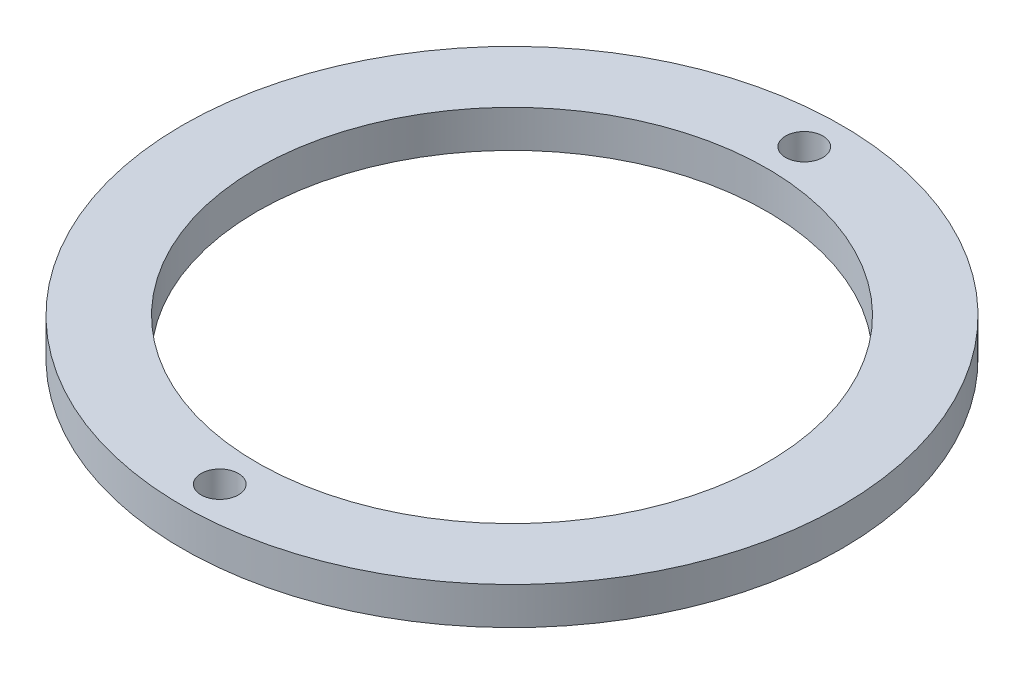
ISO-10303-21;
HEADER;
FILE_DESCRIPTION(('STEP AP214'),'2;1');
FILE_NAME('part.step','',(''),(''),'','','');
FILE_SCHEMA(('AUTOMOTIVE_DESIGN { 1 0 10303 214 1 1 1 1 }'));
ENDSEC;
DATA;
#1=APPLICATION_CONTEXT('core data for automotive mechanical design processes');
#2=APPLICATION_PROTOCOL_DEFINITION('international standard','automotive_design',2000,#1);
#3=PRODUCT_CONTEXT('',#1,'mechanical');
#4=PRODUCT('Part','Part','',(#3));
#5=PRODUCT_RELATED_PRODUCT_CATEGORY('part','',(#4));
#6=PRODUCT_DEFINITION_FORMATION('','',#4);
#7=PRODUCT_DEFINITION_CONTEXT('part definition',#1,'design');
#8=PRODUCT_DEFINITION('design','',#6,#7);
#9=PRODUCT_DEFINITION_SHAPE('','',#8);
#10=(LENGTH_UNIT() NAMED_UNIT(*) SI_UNIT(.MILLI.,.METRE.));
#11=(NAMED_UNIT(*) PLANE_ANGLE_UNIT() SI_UNIT($,.RADIAN.));
#12=(NAMED_UNIT(*) SI_UNIT($,.STERADIAN.) SOLID_ANGLE_UNIT());
#13=UNCERTAINTY_MEASURE_WITH_UNIT(LENGTH_MEASURE(1.E-05),#10,'distance_accuracy_value','');
#14=(GEOMETRIC_REPRESENTATION_CONTEXT(3) GLOBAL_UNCERTAINTY_ASSIGNED_CONTEXT((#13)) GLOBAL_UNIT_ASSIGNED_CONTEXT((#10,
#11,#12)) REPRESENTATION_CONTEXT('',''));
#15=CARTESIAN_POINT('',(0.,0.,0.));
#16=DIRECTION('',(0.,0.,1.));
#17=DIRECTION('',(1.,0.,0.));
#18=AXIS2_PLACEMENT_3D('',#15,#16,#17);
#19=CARTESIAN_POINT('',(26.5,38.6,0.));
#20=DIRECTION('',(0.,-1.,0.));
#21=DIRECTION('',(1.,0.,0.));
#22=AXIS2_PLACEMENT_3D('',#19,#20,#21);
#23=PLANE('',#22);
#24=CARTESIAN_POINT('',(0.,38.6,23.5));
#25=DIRECTION('',(0.,1.,0.));
#26=DIRECTION('',(-1.,0.,0.));
#27=AXIS2_PLACEMENT_3D('',#24,#25,#26);
#28=CIRCLE('',#27,1.5);
#29=CARTESIAN_POINT('',(-1.5,38.6,23.5));
#30=VERTEX_POINT('',#29);
#31=EDGE_CURVE('E63',#30,#30,#28,.T.);
#32=ORIENTED_EDGE('',*,*,#31,.F.);
#33=EDGE_LOOP('',(#32));
#34=FACE_BOUND('',#33,.T.);
#35=CARTESIAN_POINT('',(0.,38.6,-23.5));
#36=DIRECTION('',(0.,1.,0.));
#37=DIRECTION('',(1.,0.,0.));
#38=AXIS2_PLACEMENT_3D('',#35,#36,#37);
#39=CIRCLE('',#38,1.5);
#40=CARTESIAN_POINT('',(1.5,38.6,-23.5));
#41=VERTEX_POINT('',#40);
#42=EDGE_CURVE('E69',#41,#41,#39,.T.);
#43=ORIENTED_EDGE('',*,*,#42,.F.);
#44=EDGE_LOOP('',(#43));
#45=FACE_BOUND('',#44,.T.);
#46=CARTESIAN_POINT('',(0.,38.6,0.));
#47=DIRECTION('',(0.,1.,0.));
#48=DIRECTION('',(-1.,0.,0.));
#49=AXIS2_PLACEMENT_3D('',#46,#47,#48);
#50=CIRCLE('',#49,20.5);
#51=CARTESIAN_POINT('',(-20.5,38.6,0.));
#52=VERTEX_POINT('',#51);
#53=EDGE_CURVE('E12',#52,#52,#50,.T.);
#54=ORIENTED_EDGE('',*,*,#53,.F.);
#55=EDGE_LOOP('',(#54));
#56=FACE_BOUND('',#55,.T.);
#57=CARTESIAN_POINT('',(0.,38.6,0.));
#58=DIRECTION('',(0.,1.,0.));
#59=DIRECTION('',(-1.,0.,0.));
#60=AXIS2_PLACEMENT_3D('',#57,#58,#59);
#61=CIRCLE('',#60,26.5);
#62=CARTESIAN_POINT('',(-26.5,38.6,0.));
#63=VERTEX_POINT('',#62);
#64=EDGE_CURVE('E67',#63,#63,#61,.T.);
#65=ORIENTED_EDGE('',*,*,#64,.T.);
#66=EDGE_LOOP('',(#65));
#67=FACE_BOUND('',#66,.T.);
#68=ADVANCED_FACE('F46',(#34,#45,#56,#67),#23,.F.);
#69=CARTESIAN_POINT('',(0.,55.8894523403959,0.));
#70=DIRECTION('',(0.,1.,0.));
#71=DIRECTION('',(-1.,0.,0.));
#72=AXIS2_PLACEMENT_3D('',#69,#70,#71);
#73=CYLINDRICAL_SURFACE('',#72,20.5);
#74=CARTESIAN_POINT('',(0.,35.6,0.));
#75=DIRECTION('',(0.,1.,0.));
#76=DIRECTION('',(-1.,0.,0.));
#77=AXIS2_PLACEMENT_3D('',#74,#75,#76);
#78=CIRCLE('',#77,20.5);
#79=CARTESIAN_POINT('',(-20.5,35.6,0.));
#80=VERTEX_POINT('',#79);
#81=EDGE_CURVE('E53',#80,#80,#78,.T.);
#82=ORIENTED_EDGE('',*,*,#81,.F.);
#83=EDGE_LOOP('',(#82));
#84=FACE_BOUND('',#83,.T.);
#85=ORIENTED_EDGE('',*,*,#53,.T.);
#86=EDGE_LOOP('',(#85));
#87=FACE_BOUND('',#86,.T.);
#88=ADVANCED_FACE('F85',(#84,#87),#73,.F.);
#89=CARTESIAN_POINT('',(20.5,35.6,0.));
#90=DIRECTION('',(0.,1.,0.));
#91=DIRECTION('',(-1.,0.,0.));
#92=AXIS2_PLACEMENT_3D('',#89,#90,#91);
#93=PLANE('',#92);
#94=CARTESIAN_POINT('',(0.,35.6,23.5));
#95=DIRECTION('',(0.,1.,0.));
#96=DIRECTION('',(-1.,0.,0.));
#97=AXIS2_PLACEMENT_3D('',#94,#95,#96);
#98=CIRCLE('',#97,1.5);
#99=CARTESIAN_POINT('',(-1.5,35.6,23.5));
#100=VERTEX_POINT('',#99);
#101=EDGE_CURVE('E49',#100,#100,#98,.T.);
#102=ORIENTED_EDGE('',*,*,#101,.T.);
#103=EDGE_LOOP('',(#102));
#104=FACE_BOUND('',#103,.T.);
#105=CARTESIAN_POINT('',(0.,35.6,-23.5));
#106=DIRECTION('',(0.,1.,0.));
#107=DIRECTION('',(-1.,0.,0.));
#108=AXIS2_PLACEMENT_3D('',#105,#106,#107);
#109=CIRCLE('',#108,1.5);
#110=CARTESIAN_POINT('',(-1.5,35.6,-23.5));
#111=VERTEX_POINT('',#110);
#112=EDGE_CURVE('E61',#111,#111,#109,.T.);
#113=ORIENTED_EDGE('',*,*,#112,.T.);
#114=EDGE_LOOP('',(#113));
#115=FACE_BOUND('',#114,.T.);
#116=CARTESIAN_POINT('',(0.,35.6,0.));
#117=DIRECTION('',(0.,1.,0.));
#118=DIRECTION('',(-1.,0.,0.));
#119=AXIS2_PLACEMENT_3D('',#116,#117,#118);
#120=CIRCLE('',#119,26.5);
#121=CARTESIAN_POINT('',(-26.5,35.6,0.));
#122=VERTEX_POINT('',#121);
#123=EDGE_CURVE('E58',#122,#122,#120,.T.);
#124=ORIENTED_EDGE('',*,*,#123,.F.);
#125=EDGE_LOOP('',(#124));
#126=FACE_BOUND('',#125,.T.);
#127=ORIENTED_EDGE('',*,*,#81,.T.);
#128=EDGE_LOOP('',(#127));
#129=FACE_BOUND('',#128,.T.);
#130=ADVANCED_FACE('F82',(#104,#115,#126,#129),#93,.F.);
#131=CARTESIAN_POINT('',(0.,55.8894523403959,0.));
#132=DIRECTION('',(0.,1.,0.));
#133=DIRECTION('',(-1.,0.,0.));
#134=AXIS2_PLACEMENT_3D('',#131,#132,#133);
#135=CYLINDRICAL_SURFACE('',#134,26.5);
#136=ORIENTED_EDGE('',*,*,#64,.F.);
#137=EDGE_LOOP('',(#136));
#138=FACE_BOUND('',#137,.T.);
#139=ORIENTED_EDGE('',*,*,#123,.T.);
#140=EDGE_LOOP('',(#139));
#141=FACE_BOUND('',#140,.T.);
#142=ADVANCED_FACE('F80',(#138,#141),#135,.T.);
#143=CARTESIAN_POINT('',(0.,28.6,-23.5));
#144=DIRECTION('',(0.,1.,0.));
#145=DIRECTION('',(-1.,0.,0.));
#146=AXIS2_PLACEMENT_3D('',#143,#144,#145);
#147=CYLINDRICAL_SURFACE('',#146,1.5);
#148=ORIENTED_EDGE('',*,*,#42,.T.);
#149=EDGE_LOOP('',(#148));
#150=FACE_BOUND('',#149,.T.);
#151=ORIENTED_EDGE('',*,*,#112,.F.);
#152=EDGE_LOOP('',(#151));
#153=FACE_BOUND('',#152,.T.);
#154=ADVANCED_FACE('F98',(#150,#153),#147,.F.);
#155=CARTESIAN_POINT('',(0.,28.6,23.5));
#156=DIRECTION('',(0.,1.,0.));
#157=DIRECTION('',(-1.,0.,0.));
#158=AXIS2_PLACEMENT_3D('',#155,#156,#157);
#159=CYLINDRICAL_SURFACE('',#158,1.5);
#160=ORIENTED_EDGE('',*,*,#31,.T.);
#161=EDGE_LOOP('',(#160));
#162=FACE_BOUND('',#161,.T.);
#163=ORIENTED_EDGE('',*,*,#101,.F.);
#164=EDGE_LOOP('',(#163));
#165=FACE_BOUND('',#164,.T.);
#166=ADVANCED_FACE('F102',(#162,#165),#159,.F.);
#167=CLOSED_SHELL('',(#68,#88,#130,#142,#154,#166));
#168=MANIFOLD_SOLID_BREP('B2',#167);
#169=ADVANCED_BREP_SHAPE_REPRESENTATION('',(#18,#168),#14);
#170=SHAPE_DEFINITION_REPRESENTATION(#9,#169);
ENDSEC;
END-ISO-10303-21;
